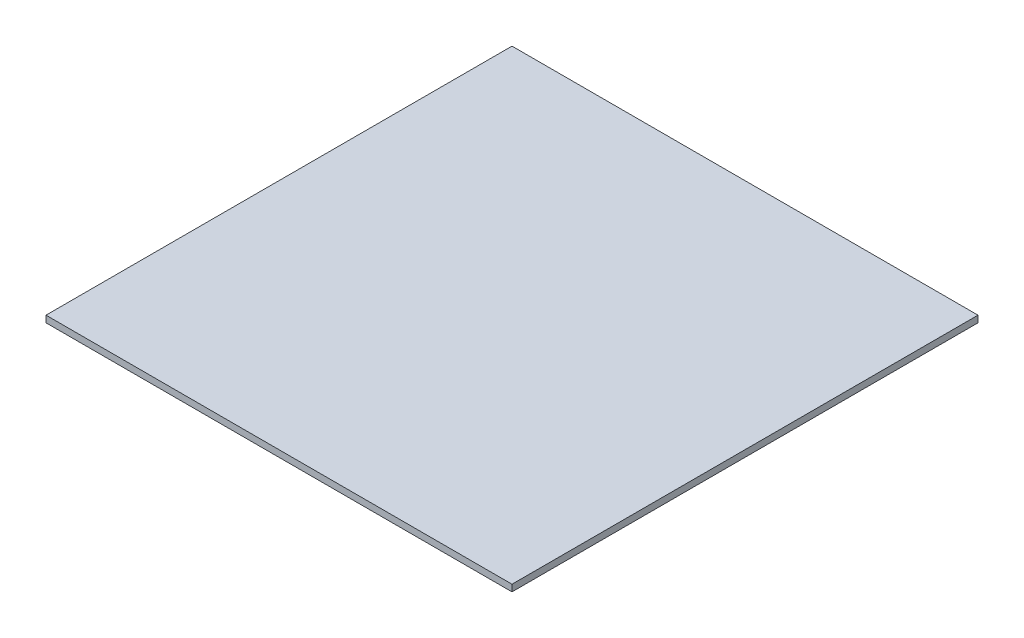
ISO-10303-21;
HEADER;
FILE_DESCRIPTION(('STEP AP214'),'2;1');
FILE_NAME('part.step','',(''),(''),'','','');
FILE_SCHEMA(('AUTOMOTIVE_DESIGN { 1 0 10303 214 1 1 1 1 }'));
ENDSEC;
DATA;
#1=APPLICATION_CONTEXT('core data for automotive mechanical design processes');
#2=APPLICATION_PROTOCOL_DEFINITION('international standard','automotive_design',2000,#1);
#3=PRODUCT_CONTEXT('',#1,'mechanical');
#4=PRODUCT('Part','Part','',(#3));
#5=PRODUCT_RELATED_PRODUCT_CATEGORY('part','',(#4));
#6=PRODUCT_DEFINITION_FORMATION('','',#4);
#7=PRODUCT_DEFINITION_CONTEXT('part definition',#1,'design');
#8=PRODUCT_DEFINITION('design','',#6,#7);
#9=PRODUCT_DEFINITION_SHAPE('','',#8);
#10=(LENGTH_UNIT() NAMED_UNIT(*) SI_UNIT(.MILLI.,.METRE.));
#11=(NAMED_UNIT(*) PLANE_ANGLE_UNIT() SI_UNIT($,.RADIAN.));
#12=(NAMED_UNIT(*) SI_UNIT($,.STERADIAN.) SOLID_ANGLE_UNIT());
#13=UNCERTAINTY_MEASURE_WITH_UNIT(LENGTH_MEASURE(1.E-05),#10,'distance_accuracy_value','');
#14=(GEOMETRIC_REPRESENTATION_CONTEXT(3) GLOBAL_UNCERTAINTY_ASSIGNED_CONTEXT((#13)) GLOBAL_UNIT_ASSIGNED_CONTEXT((#10,
#11,#12)) REPRESENTATION_CONTEXT('',''));
#15=CARTESIAN_POINT('',(0.,0.,0.));
#16=DIRECTION('',(0.,0.,1.));
#17=DIRECTION('',(1.,0.,0.));
#18=AXIS2_PLACEMENT_3D('',#15,#16,#17);
#19=CARTESIAN_POINT('',(350.,10.,350.));
#20=DIRECTION('',(-1.,0.,0.));
#21=DIRECTION('',(0.,0.,1.));
#22=AXIS2_PLACEMENT_3D('',#19,#20,#21);
#23=PLANE('',#22);
#24=DIRECTION('',(0.,0.,-1.));
#25=VECTOR('',#24,1.);
#26=CARTESIAN_POINT('',(350.,0.,350.));
#27=LINE('',#26,#25);
#28=CARTESIAN_POINT('',(350.,0.,350.));
#29=VERTEX_POINT('',#28);
#30=CARTESIAN_POINT('',(350.,0.,-350.));
#31=VERTEX_POINT('',#30);
#32=EDGE_CURVE('E115',#29,#31,#27,.T.);
#33=ORIENTED_EDGE('',*,*,#32,.T.);
#34=DIRECTION('',(0.,-1.,0.));
#35=VECTOR('',#34,1.);
#36=CARTESIAN_POINT('',(350.,10.,-350.));
#37=LINE('',#36,#35);
#38=CARTESIAN_POINT('',(350.,10.,-350.));
#39=VERTEX_POINT('',#38);
#40=EDGE_CURVE('E12',#39,#31,#37,.T.);
#41=ORIENTED_EDGE('',*,*,#40,.F.);
#42=DIRECTION('',(0.,0.,-1.));
#43=VECTOR('',#42,1.);
#44=CARTESIAN_POINT('',(350.,10.,350.));
#45=LINE('',#44,#43);
#46=CARTESIAN_POINT('',(350.,10.,350.));
#47=VERTEX_POINT('',#46);
#48=EDGE_CURVE('E88',#47,#39,#45,.T.);
#49=ORIENTED_EDGE('',*,*,#48,.F.);
#50=DIRECTION('',(0.,-1.,0.));
#51=VECTOR('',#50,1.);
#52=CARTESIAN_POINT('',(350.,10.,350.));
#53=LINE('',#52,#51);
#54=EDGE_CURVE('E96',#47,#29,#53,.T.);
#55=ORIENTED_EDGE('',*,*,#54,.T.);
#56=EDGE_LOOP('',(#33,#41,#49,#55));
#57=FACE_BOUND('',#56,.T.);
#58=ADVANCED_FACE('F37',(#57),#23,.F.);
#59=CARTESIAN_POINT('',(-350.,10.,-350.));
#60=DIRECTION('',(0.,0.,1.));
#61=DIRECTION('',(1.,0.,0.));
#62=AXIS2_PLACEMENT_3D('',#59,#60,#61);
#63=PLANE('',#62);
#64=DIRECTION('',(-1.,0.,0.));
#65=VECTOR('',#64,1.);
#66=CARTESIAN_POINT('',(-350.,0.,-350.));
#67=LINE('',#66,#65);
#68=CARTESIAN_POINT('',(-350.,0.,-350.));
#69=VERTEX_POINT('',#68);
#70=EDGE_CURVE('E92',#31,#69,#67,.T.);
#71=ORIENTED_EDGE('',*,*,#70,.T.);
#72=DIRECTION('',(0.,-1.,0.));
#73=VECTOR('',#72,1.);
#74=CARTESIAN_POINT('',(-350.,10.,-350.));
#75=LINE('',#74,#73);
#76=CARTESIAN_POINT('',(-350.,10.,-350.));
#77=VERTEX_POINT('',#76);
#78=EDGE_CURVE('E45',#77,#69,#75,.T.);
#79=ORIENTED_EDGE('',*,*,#78,.F.);
#80=DIRECTION('',(-1.,0.,0.));
#81=VECTOR('',#80,1.);
#82=CARTESIAN_POINT('',(-350.,10.,-350.));
#83=LINE('',#82,#81);
#84=EDGE_CURVE('E83',#39,#77,#83,.T.);
#85=ORIENTED_EDGE('',*,*,#84,.F.);
#86=ORIENTED_EDGE('',*,*,#40,.T.);
#87=EDGE_LOOP('',(#71,#79,#85,#86));
#88=FACE_BOUND('',#87,.T.);
#89=ADVANCED_FACE('F91',(#88),#63,.F.);
#90=CARTESIAN_POINT('',(-350.,10.,350.));
#91=DIRECTION('',(1.,0.,0.));
#92=DIRECTION('',(0.,0.,-1.));
#93=AXIS2_PLACEMENT_3D('',#90,#91,#92);
#94=PLANE('',#93);
#95=DIRECTION('',(0.,0.,1.));
#96=VECTOR('',#95,1.);
#97=CARTESIAN_POINT('',(-350.,0.,350.));
#98=LINE('',#97,#96);
#99=CARTESIAN_POINT('',(-350.,0.,350.));
#100=VERTEX_POINT('',#99);
#101=EDGE_CURVE('E70',#69,#100,#98,.T.);
#102=ORIENTED_EDGE('',*,*,#101,.T.);
#103=DIRECTION('',(0.,-1.,0.));
#104=VECTOR('',#103,1.);
#105=CARTESIAN_POINT('',(-350.,10.,350.));
#106=LINE('',#105,#104);
#107=CARTESIAN_POINT('',(-350.,10.,350.));
#108=VERTEX_POINT('',#107);
#109=EDGE_CURVE('E93',#108,#100,#106,.T.);
#110=ORIENTED_EDGE('',*,*,#109,.F.);
#111=DIRECTION('',(0.,0.,1.));
#112=VECTOR('',#111,1.);
#113=CARTESIAN_POINT('',(-350.,10.,350.));
#114=LINE('',#113,#112);
#115=EDGE_CURVE('E86',#77,#108,#114,.T.);
#116=ORIENTED_EDGE('',*,*,#115,.F.);
#117=ORIENTED_EDGE('',*,*,#78,.T.);
#118=EDGE_LOOP('',(#102,#110,#116,#117));
#119=FACE_BOUND('',#118,.T.);
#120=ADVANCED_FACE('F94',(#119),#94,.F.);
#121=CARTESIAN_POINT('',(-350.,10.,350.));
#122=DIRECTION('',(0.,0.,-1.));
#123=DIRECTION('',(-1.,0.,0.));
#124=AXIS2_PLACEMENT_3D('',#121,#122,#123);
#125=PLANE('',#124);
#126=DIRECTION('',(1.,0.,0.));
#127=VECTOR('',#126,1.);
#128=CARTESIAN_POINT('',(-350.,0.,350.));
#129=LINE('',#128,#127);
#130=EDGE_CURVE('E76',#100,#29,#129,.T.);
#131=ORIENTED_EDGE('',*,*,#130,.T.);
#132=ORIENTED_EDGE('',*,*,#54,.F.);
#133=DIRECTION('',(1.,0.,0.));
#134=VECTOR('',#133,1.);
#135=CARTESIAN_POINT('',(-350.,10.,350.));
#136=LINE('',#135,#134);
#137=EDGE_CURVE('E53',#108,#47,#136,.T.);
#138=ORIENTED_EDGE('',*,*,#137,.F.);
#139=ORIENTED_EDGE('',*,*,#109,.T.);
#140=EDGE_LOOP('',(#131,#132,#138,#139));
#141=FACE_BOUND('',#140,.T.);
#142=ADVANCED_FACE('F110',(#141),#125,.F.);
#143=CARTESIAN_POINT('',(0.,10.,0.));
#144=DIRECTION('',(0.,-1.,0.));
#145=DIRECTION('',(0.,0.,-1.));
#146=AXIS2_PLACEMENT_3D('',#143,#144,#145);
#147=PLANE('',#146);
#148=ORIENTED_EDGE('',*,*,#48,.T.);
#149=ORIENTED_EDGE('',*,*,#84,.T.);
#150=ORIENTED_EDGE('',*,*,#115,.T.);
#151=ORIENTED_EDGE('',*,*,#137,.T.);
#152=EDGE_LOOP('',(#148,#149,#150,#151));
#153=FACE_BOUND('',#152,.T.);
#154=ADVANCED_FACE('F84',(#153),#147,.F.);
#155=CARTESIAN_POINT('',(0.,0.,0.));
#156=DIRECTION('',(0.,-1.,0.));
#157=DIRECTION('',(0.,0.,-1.));
#158=AXIS2_PLACEMENT_3D('',#155,#156,#157);
#159=PLANE('',#158);
#160=ORIENTED_EDGE('',*,*,#32,.F.);
#161=ORIENTED_EDGE('',*,*,#130,.F.);
#162=ORIENTED_EDGE('',*,*,#101,.F.);
#163=ORIENTED_EDGE('',*,*,#70,.F.);
#164=EDGE_LOOP('',(#160,#161,#162,#163));
#165=FACE_BOUND('',#164,.T.);
#166=ADVANCED_FACE('F113',(#165),#159,.T.);
#167=CLOSED_SHELL('',(#58,#89,#120,#142,#154,#166));
#168=MANIFOLD_SOLID_BREP('B2',#167);
#169=ADVANCED_BREP_SHAPE_REPRESENTATION('',(#18,#168),#14);
#170=SHAPE_DEFINITION_REPRESENTATION(#9,#169);
ENDSEC;
END-ISO-10303-21;
